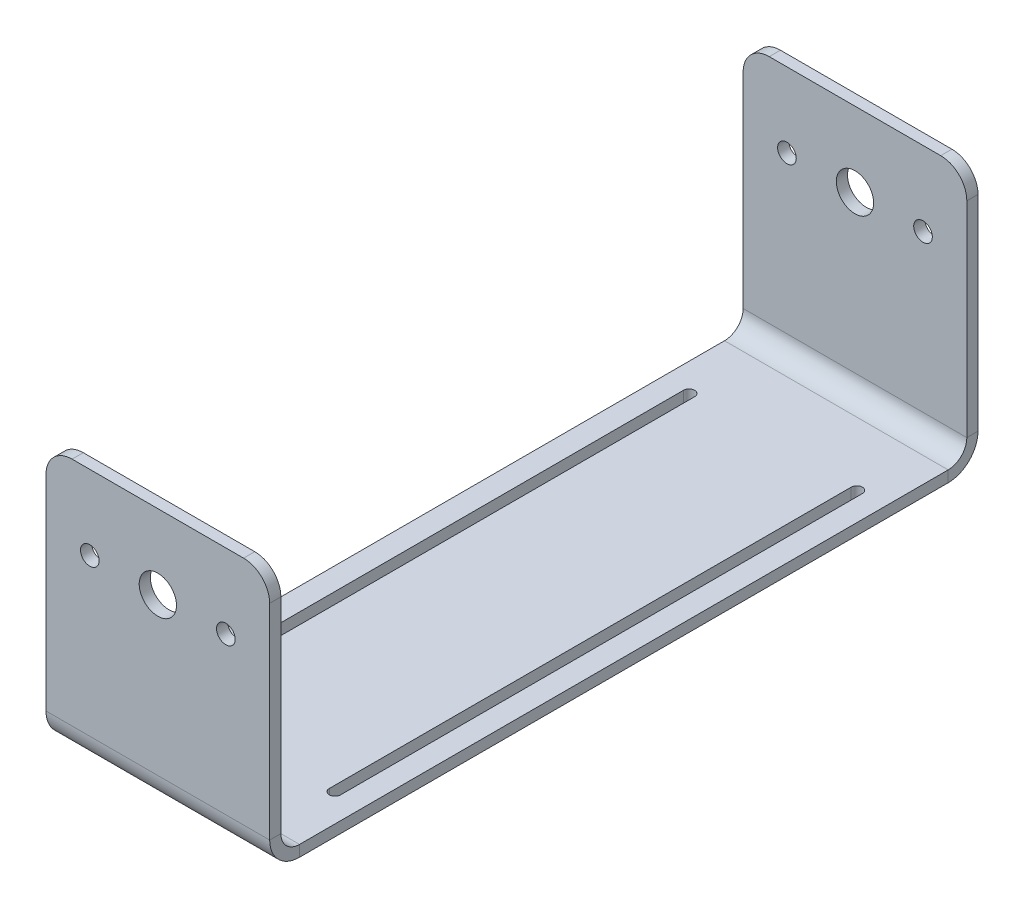
ISO-10303-21;
HEADER;
FILE_DESCRIPTION(('STEP AP214'),'2;1');
FILE_NAME('part.step','',(''),(''),'','','');
FILE_SCHEMA(('AUTOMOTIVE_DESIGN { 1 0 10303 214 1 1 1 1 }'));
ENDSEC;
DATA;
#1=APPLICATION_CONTEXT('core data for automotive mechanical design processes');
#2=APPLICATION_PROTOCOL_DEFINITION('international standard','automotive_design',2000,#1);
#3=PRODUCT_CONTEXT('',#1,'mechanical');
#4=PRODUCT('Part','Part','',(#3));
#5=PRODUCT_RELATED_PRODUCT_CATEGORY('part','',(#4));
#6=PRODUCT_DEFINITION_FORMATION('','',#4);
#7=PRODUCT_DEFINITION_CONTEXT('part definition',#1,'design');
#8=PRODUCT_DEFINITION('design','',#6,#7);
#9=PRODUCT_DEFINITION_SHAPE('','',#8);
#10=(LENGTH_UNIT() NAMED_UNIT(*) SI_UNIT(.MILLI.,.METRE.));
#11=(NAMED_UNIT(*) PLANE_ANGLE_UNIT() SI_UNIT($,.RADIAN.));
#12=(NAMED_UNIT(*) SI_UNIT($,.STERADIAN.) SOLID_ANGLE_UNIT());
#13=UNCERTAINTY_MEASURE_WITH_UNIT(LENGTH_MEASURE(1.E-05),#10,'distance_accuracy_value','');
#14=(GEOMETRIC_REPRESENTATION_CONTEXT(3) GLOBAL_UNCERTAINTY_ASSIGNED_CONTEXT((#13)) GLOBAL_UNIT_ASSIGNED_CONTEXT((#10,
#11,#12)) REPRESENTATION_CONTEXT('',''));
#15=CARTESIAN_POINT('',(0.,0.,0.));
#16=DIRECTION('',(0.,0.,1.));
#17=DIRECTION('',(1.,0.,0.));
#18=AXIS2_PLACEMENT_3D('',#15,#16,#17);
#19=CARTESIAN_POINT('',(60.,0.,-87.));
#20=DIRECTION('',(1.,0.,0.));
#21=DIRECTION('',(0.,0.,-1.));
#22=AXIS2_PLACEMENT_3D('',#19,#20,#21);
#23=PLANE('',#22);
#24=DIRECTION('',(0.,1.,0.));
#25=VECTOR('',#24,1.);
#26=CARTESIAN_POINT('',(60.,0.,-87.));
#27=LINE('',#26,#25);
#28=CARTESIAN_POINT('',(60.,0.,-87.));
#29=VERTEX_POINT('',#28);
#30=CARTESIAN_POINT('',(60.,3.00000000000003,-87.));
#31=VERTEX_POINT('',#30);
#32=EDGE_CURVE('E413',#29,#31,#27,.T.);
#33=ORIENTED_EDGE('',*,*,#32,.F.);
#34=CARTESIAN_POINT('',(60.,8.00000000000003,-87.));
#35=DIRECTION('',(1.,0.,0.));
#36=DIRECTION('',(0.,0.,-1.));
#37=AXIS2_PLACEMENT_3D('',#34,#35,#36);
#38=CIRCLE('',#37,8.);
#39=CARTESIAN_POINT('',(60.,8.00000000000004,-95.));
#40=VERTEX_POINT('',#39);
#41=EDGE_CURVE('E320',#40,#29,#38,.F.);
#42=ORIENTED_EDGE('',*,*,#41,.F.);
#43=DIRECTION('',(0.,0.,-1.));
#44=VECTOR('',#43,1.);
#45=CARTESIAN_POINT('',(60.,8.00000000000004,-92.));
#46=LINE('',#45,#44);
#47=CARTESIAN_POINT('',(60.,8.00000000000004,-92.));
#48=VERTEX_POINT('',#47);
#49=EDGE_CURVE('E410',#48,#40,#46,.T.);
#50=ORIENTED_EDGE('',*,*,#49,.F.);
#51=CARTESIAN_POINT('',(60.,8.00000000000003,-87.));
#52=DIRECTION('',(1.,0.,0.));
#53=DIRECTION('',(0.,0.,-1.));
#54=AXIS2_PLACEMENT_3D('',#51,#52,#53);
#55=CIRCLE('',#54,5.);
#56=EDGE_CURVE('E327',#48,#31,#55,.F.);
#57=ORIENTED_EDGE('',*,*,#56,.T.);
#58=EDGE_LOOP('',(#33,#42,#50,#57));
#59=FACE_BOUND('',#58,.T.);
#60=ADVANCED_FACE('F38',(#59),#23,.T.);
#61=CARTESIAN_POINT('',(60.,8.00000000000004,-92.));
#62=DIRECTION('',(1.,0.,0.));
#63=DIRECTION('',(0.,0.,-1.));
#64=AXIS2_PLACEMENT_3D('',#61,#62,#63);
#65=PLANE('',#64);
#66=DIRECTION('',(0.,0.,1.));
#67=VECTOR('',#66,1.);
#68=CARTESIAN_POINT('',(60.,0.,95.));
#69=LINE('',#68,#67);
#70=CARTESIAN_POINT('',(60.,0.,87.));
#71=VERTEX_POINT('',#70);
#72=EDGE_CURVE('E317',#29,#71,#69,.T.);
#73=ORIENTED_EDGE('',*,*,#72,.F.);
#74=ORIENTED_EDGE('',*,*,#32,.T.);
#75=DIRECTION('',(0.,0.,1.));
#76=VECTOR('',#75,1.);
#77=CARTESIAN_POINT('',(60.,3.,95.));
#78=LINE('',#77,#76);
#79=CARTESIAN_POINT('',(60.,3.,87.));
#80=VERTEX_POINT('',#79);
#81=EDGE_CURVE('E330',#31,#80,#78,.T.);
#82=ORIENTED_EDGE('',*,*,#81,.T.);
#83=DIRECTION('',(0.,-1.,0.));
#84=VECTOR('',#83,1.);
#85=CARTESIAN_POINT('',(60.,3.,87.));
#86=LINE('',#85,#84);
#87=EDGE_CURVE('E401',#80,#71,#86,.T.);
#88=ORIENTED_EDGE('',*,*,#87,.T.);
#89=EDGE_LOOP('',(#73,#74,#82,#88));
#90=FACE_BOUND('',#89,.T.);
#91=ADVANCED_FACE('F479',(#90),#65,.T.);
#92=CARTESIAN_POINT('',(0.,8.00000000000004,-95.));
#93=DIRECTION('',(-1.,0.,0.));
#94=DIRECTION('',(0.,0.,1.));
#95=AXIS2_PLACEMENT_3D('',#92,#93,#94);
#96=PLANE('',#95);
#97=DIRECTION('',(0.,0.,1.));
#98=VECTOR('',#97,1.);
#99=CARTESIAN_POINT('',(0.,8.00000000000004,-95.));
#100=LINE('',#99,#98);
#101=CARTESIAN_POINT('',(0.,8.00000000000004,-95.));
#102=VERTEX_POINT('',#101);
#103=CARTESIAN_POINT('',(0.,8.00000000000004,-92.));
#104=VERTEX_POINT('',#103);
#105=EDGE_CURVE('E407',#102,#104,#100,.T.);
#106=ORIENTED_EDGE('',*,*,#105,.F.);
#107=CARTESIAN_POINT('',(0.,8.00000000000003,-87.));
#108=DIRECTION('',(1.,0.,0.));
#109=DIRECTION('',(0.,0.,-1.));
#110=AXIS2_PLACEMENT_3D('',#107,#108,#109);
#111=CIRCLE('',#110,8.);
#112=CARTESIAN_POINT('',(0.,0.,-87.));
#113=VERTEX_POINT('',#112);
#114=EDGE_CURVE('E348',#102,#113,#111,.F.);
#115=ORIENTED_EDGE('',*,*,#114,.T.);
#116=DIRECTION('',(0.,-1.,0.));
#117=VECTOR('',#116,1.);
#118=CARTESIAN_POINT('',(0.,3.00000000000003,-87.));
#119=LINE('',#118,#117);
#120=CARTESIAN_POINT('',(0.,3.00000000000003,-87.));
#121=VERTEX_POINT('',#120);
#122=EDGE_CURVE('E405',#121,#113,#119,.T.);
#123=ORIENTED_EDGE('',*,*,#122,.F.);
#124=CARTESIAN_POINT('',(0.,8.00000000000003,-87.));
#125=DIRECTION('',(1.,0.,0.));
#126=DIRECTION('',(0.,0.,-1.));
#127=AXIS2_PLACEMENT_3D('',#124,#125,#126);
#128=CIRCLE('',#127,5.);
#129=EDGE_CURVE('E355',#104,#121,#128,.F.);
#130=ORIENTED_EDGE('',*,*,#129,.F.);
#131=EDGE_LOOP('',(#106,#115,#123,#130));
#132=FACE_BOUND('',#131,.T.);
#133=ADVANCED_FACE('F540',(#132),#96,.T.);
#134=CARTESIAN_POINT('',(0.,3.00000000000003,-87.));
#135=DIRECTION('',(-1.,0.,0.));
#136=DIRECTION('',(0.,0.,1.));
#137=AXIS2_PLACEMENT_3D('',#134,#135,#136);
#138=PLANE('',#137);
#139=DIRECTION('',(0.,-1.,0.));
#140=VECTOR('',#139,1.);
#141=CARTESIAN_POINT('',(0.,0.,-92.));
#142=LINE('',#141,#140);
#143=CARTESIAN_POINT('',(0.,63.,-92.));
#144=VERTEX_POINT('',#143);
#145=EDGE_CURVE('E353',#144,#104,#142,.T.);
#146=ORIENTED_EDGE('',*,*,#145,.F.);
#147=DIRECTION('',(0.,0.,-1.));
#148=VECTOR('',#147,1.);
#149=CARTESIAN_POINT('',(0.,63.,-86.9999999999997));
#150=LINE('',#149,#148);
#151=CARTESIAN_POINT('',(0.,63.0000000000001,-95.));
#152=VERTEX_POINT('',#151);
#153=EDGE_CURVE('E11',#144,#152,#150,.T.);
#154=ORIENTED_EDGE('',*,*,#153,.T.);
#155=DIRECTION('',(0.,-1.,0.));
#156=VECTOR('',#155,1.);
#157=CARTESIAN_POINT('',(0.,0.,-95.));
#158=LINE('',#157,#156);
#159=EDGE_CURVE('E351',#152,#102,#158,.T.);
#160=ORIENTED_EDGE('',*,*,#159,.T.);
#161=ORIENTED_EDGE('',*,*,#105,.T.);
#162=EDGE_LOOP('',(#146,#154,#160,#161));
#163=FACE_BOUND('',#162,.T.);
#164=ADVANCED_FACE('F556',(#163),#138,.T.);
#165=CARTESIAN_POINT('',(60.,8.,95.));
#166=DIRECTION('',(1.,0.,0.));
#167=DIRECTION('',(0.,0.,-1.));
#168=AXIS2_PLACEMENT_3D('',#165,#166,#167);
#169=PLANE('',#168);
#170=DIRECTION('',(0.,0.,-1.));
#171=VECTOR('',#170,1.);
#172=CARTESIAN_POINT('',(60.,8.,95.));
#173=LINE('',#172,#171);
#174=CARTESIAN_POINT('',(60.,8.,95.));
#175=VERTEX_POINT('',#174);
#176=CARTESIAN_POINT('',(60.,8.,92.));
#177=VERTEX_POINT('',#176);
#178=EDGE_CURVE('E403',#175,#177,#173,.T.);
#179=ORIENTED_EDGE('',*,*,#178,.F.);
#180=CARTESIAN_POINT('',(60.,8.,87.));
#181=DIRECTION('',(1.,0.,0.));
#182=DIRECTION('',(0.,0.,-1.));
#183=AXIS2_PLACEMENT_3D('',#180,#181,#182);
#184=CIRCLE('',#183,8.);
#185=EDGE_CURVE('E314',#71,#175,#184,.F.);
#186=ORIENTED_EDGE('',*,*,#185,.F.);
#187=ORIENTED_EDGE('',*,*,#87,.F.);
#188=CARTESIAN_POINT('',(60.,8.,87.));
#189=DIRECTION('',(1.,0.,0.));
#190=DIRECTION('',(0.,0.,-1.));
#191=AXIS2_PLACEMENT_3D('',#188,#189,#190);
#192=CIRCLE('',#191,5.);
#193=EDGE_CURVE('E333',#80,#177,#192,.F.);
#194=ORIENTED_EDGE('',*,*,#193,.T.);
#195=EDGE_LOOP('',(#179,#186,#187,#194));
#196=FACE_BOUND('',#195,.T.);
#197=ADVANCED_FACE('F488',(#196),#169,.T.);
#198=CARTESIAN_POINT('',(60.,3.,87.));
#199=DIRECTION('',(1.,0.,0.));
#200=DIRECTION('',(0.,0.,-1.));
#201=AXIS2_PLACEMENT_3D('',#198,#199,#200);
#202=PLANE('',#201);
#203=DIRECTION('',(0.,1.,0.));
#204=VECTOR('',#203,1.);
#205=CARTESIAN_POINT('',(60.,0.,92.));
#206=LINE('',#205,#204);
#207=CARTESIAN_POINT('',(60.,63.,92.));
#208=VERTEX_POINT('',#207);
#209=EDGE_CURVE('E307',#177,#208,#206,.T.);
#210=ORIENTED_EDGE('',*,*,#209,.T.);
#211=DIRECTION('',(0.,0.,-1.));
#212=VECTOR('',#211,1.);
#213=CARTESIAN_POINT('',(60.,63.,87.));
#214=LINE('',#213,#212);
#215=CARTESIAN_POINT('',(60.,63.,95.));
#216=VERTEX_POINT('',#215);
#217=EDGE_CURVE('E430',#208,#216,#214,.F.);
#218=ORIENTED_EDGE('',*,*,#217,.T.);
#219=DIRECTION('',(0.,1.,0.));
#220=VECTOR('',#219,1.);
#221=CARTESIAN_POINT('',(60.,0.,95.));
#222=LINE('',#221,#220);
#223=EDGE_CURVE('E310',#175,#216,#222,.T.);
#224=ORIENTED_EDGE('',*,*,#223,.F.);
#225=ORIENTED_EDGE('',*,*,#178,.T.);
#226=EDGE_LOOP('',(#210,#218,#224,#225));
#227=FACE_BOUND('',#226,.T.);
#228=ADVANCED_FACE('F498',(#227),#202,.T.);
#229=CARTESIAN_POINT('',(0.,0.,87.));
#230=DIRECTION('',(-1.,0.,0.));
#231=DIRECTION('',(0.,0.,1.));
#232=AXIS2_PLACEMENT_3D('',#229,#230,#231);
#233=PLANE('',#232);
#234=DIRECTION('',(0.,1.,0.));
#235=VECTOR('',#234,1.);
#236=CARTESIAN_POINT('',(0.,0.,87.));
#237=LINE('',#236,#235);
#238=CARTESIAN_POINT('',(0.,0.,87.));
#239=VERTEX_POINT('',#238);
#240=CARTESIAN_POINT('',(0.,3.,87.));
#241=VERTEX_POINT('',#240);
#242=EDGE_CURVE('E399',#239,#241,#237,.T.);
#243=ORIENTED_EDGE('',*,*,#242,.F.);
#244=CARTESIAN_POINT('',(0.,8.,87.));
#245=DIRECTION('',(1.,0.,0.));
#246=DIRECTION('',(0.,0.,-1.));
#247=AXIS2_PLACEMENT_3D('',#244,#245,#246);
#248=CIRCLE('',#247,8.);
#249=CARTESIAN_POINT('',(0.,8.,95.));
#250=VERTEX_POINT('',#249);
#251=EDGE_CURVE('E342',#239,#250,#248,.F.);
#252=ORIENTED_EDGE('',*,*,#251,.T.);
#253=DIRECTION('',(0.,0.,1.));
#254=VECTOR('',#253,1.);
#255=CARTESIAN_POINT('',(0.,8.,92.));
#256=LINE('',#255,#254);
#257=CARTESIAN_POINT('',(0.,8.,92.));
#258=VERTEX_POINT('',#257);
#259=EDGE_CURVE('E397',#258,#250,#256,.T.);
#260=ORIENTED_EDGE('',*,*,#259,.F.);
#261=CARTESIAN_POINT('',(0.,8.,87.));
#262=DIRECTION('',(1.,0.,0.));
#263=DIRECTION('',(0.,0.,-1.));
#264=AXIS2_PLACEMENT_3D('',#261,#262,#263);
#265=CIRCLE('',#264,5.);
#266=EDGE_CURVE('E311',#241,#258,#265,.F.);
#267=ORIENTED_EDGE('',*,*,#266,.F.);
#268=EDGE_LOOP('',(#243,#252,#260,#267));
#269=FACE_BOUND('',#268,.T.);
#270=ADVANCED_FACE('F518',(#269),#233,.T.);
#271=CARTESIAN_POINT('',(0.,8.,92.));
#272=DIRECTION('',(-1.,0.,0.));
#273=DIRECTION('',(0.,0.,1.));
#274=AXIS2_PLACEMENT_3D('',#271,#272,#273);
#275=PLANE('',#274);
#276=DIRECTION('',(0.,0.,1.));
#277=VECTOR('',#276,1.);
#278=CARTESIAN_POINT('',(0.,0.,95.));
#279=LINE('',#278,#277);
#280=EDGE_CURVE('E345',#113,#239,#279,.T.);
#281=ORIENTED_EDGE('',*,*,#280,.T.);
#282=ORIENTED_EDGE('',*,*,#242,.T.);
#283=DIRECTION('',(0.,0.,1.));
#284=VECTOR('',#283,1.);
#285=CARTESIAN_POINT('',(0.,3.,95.));
#286=LINE('',#285,#284);
#287=EDGE_CURVE('E358',#121,#241,#286,.T.);
#288=ORIENTED_EDGE('',*,*,#287,.F.);
#289=ORIENTED_EDGE('',*,*,#122,.T.);
#290=EDGE_LOOP('',(#281,#282,#288,#289));
#291=FACE_BOUND('',#290,.T.);
#292=ADVANCED_FACE('F524',(#291),#275,.T.);
#293=CARTESIAN_POINT('',(60.,0.,92.));
#294=DIRECTION('',(0.,0.,1.));
#295=DIRECTION('',(1.,0.,0.));
#296=AXIS2_PLACEMENT_3D('',#293,#294,#295);
#297=PLANE('',#296);
#298=CARTESIAN_POINT('',(48.25,50.,92.));
#299=DIRECTION('',(0.,0.,1.));
#300=DIRECTION('',(1.,0.,0.));
#301=AXIS2_PLACEMENT_3D('',#298,#299,#300);
#302=CIRCLE('',#301,2.5);
#303=CARTESIAN_POINT('',(50.75,50.,92.));
#304=VERTEX_POINT('',#303);
#305=EDGE_CURVE('E303',#304,#304,#302,.T.);
#306=ORIENTED_EDGE('',*,*,#305,.T.);
#307=EDGE_LOOP('',(#306));
#308=FACE_BOUND('',#307,.T.);
#309=CARTESIAN_POINT('',(11.75,50.,92.));
#310=DIRECTION('',(0.,0.,1.));
#311=DIRECTION('',(1.,0.,0.));
#312=AXIS2_PLACEMENT_3D('',#309,#310,#311);
#313=CIRCLE('',#312,2.5);
#314=CARTESIAN_POINT('',(14.25,50.,92.));
#315=VERTEX_POINT('',#314);
#316=EDGE_CURVE('E299',#315,#315,#313,.T.);
#317=ORIENTED_EDGE('',*,*,#316,.T.);
#318=EDGE_LOOP('',(#317));
#319=FACE_BOUND('',#318,.T.);
#320=CARTESIAN_POINT('',(30.,50.,92.));
#321=DIRECTION('',(0.,0.,1.));
#322=DIRECTION('',(1.,0.,0.));
#323=AXIS2_PLACEMENT_3D('',#320,#321,#322);
#324=CIRCLE('',#323,5.);
#325=CARTESIAN_POINT('',(35.,50.,92.));
#326=VERTEX_POINT('',#325);
#327=EDGE_CURVE('E295',#326,#326,#324,.T.);
#328=ORIENTED_EDGE('',*,*,#327,.T.);
#329=EDGE_LOOP('',(#328));
#330=FACE_BOUND('',#329,.T.);
#331=DIRECTION('',(-1.,0.,0.));
#332=VECTOR('',#331,1.);
#333=CARTESIAN_POINT('',(60.,70.,92.));
#334=LINE('',#333,#332);
#335=CARTESIAN_POINT('',(53.,70.,92.));
#336=VERTEX_POINT('',#335);
#337=CARTESIAN_POINT('',(7.,70.,92.));
#338=VERTEX_POINT('',#337);
#339=EDGE_CURVE('E394',#336,#338,#334,.T.);
#340=ORIENTED_EDGE('',*,*,#339,.F.);
#341=CARTESIAN_POINT('',(53.,63.,92.));
#342=DIRECTION('',(0.,0.,1.));
#343=DIRECTION('',(1.,0.,0.));
#344=AXIS2_PLACEMENT_3D('',#341,#342,#343);
#345=CIRCLE('',#344,7.);
#346=EDGE_CURVE('E428',#336,#208,#345,.F.);
#347=ORIENTED_EDGE('',*,*,#346,.T.);
#348=ORIENTED_EDGE('',*,*,#209,.F.);
#349=DIRECTION('',(-1.,0.,0.));
#350=VECTOR('',#349,1.);
#351=CARTESIAN_POINT('',(60.,8.,92.));
#352=LINE('',#351,#350);
#353=EDGE_CURVE('E336',#177,#258,#352,.T.);
#354=ORIENTED_EDGE('',*,*,#353,.T.);
#355=DIRECTION('',(0.,1.,0.));
#356=VECTOR('',#355,1.);
#357=CARTESIAN_POINT('',(0.,0.,92.));
#358=LINE('',#357,#356);
#359=CARTESIAN_POINT('',(0.,63.,92.));
#360=VERTEX_POINT('',#359);
#361=EDGE_CURVE('E306',#258,#360,#358,.T.);
#362=ORIENTED_EDGE('',*,*,#361,.T.);
#363=CARTESIAN_POINT('',(7.,63.,92.));
#364=DIRECTION('',(0.,0.,1.));
#365=DIRECTION('',(1.,0.,0.));
#366=AXIS2_PLACEMENT_3D('',#363,#364,#365);
#367=CIRCLE('',#366,7.);
#368=EDGE_CURVE('E426',#360,#338,#367,.F.);
#369=ORIENTED_EDGE('',*,*,#368,.T.);
#370=EDGE_LOOP('',(#340,#347,#348,#354,#362,#369));
#371=FACE_BOUND('',#370,.T.);
#372=ADVANCED_FACE('F522',(#308,#319,#330,#371),#297,.F.);
#373=CARTESIAN_POINT('',(60.,70.,95.));
#374=DIRECTION('',(0.,1.,0.));
#375=DIRECTION('',(0.,0.,1.));
#376=AXIS2_PLACEMENT_3D('',#373,#374,#375);
#377=PLANE('',#376);
#378=DIRECTION('',(-1.,0.,0.));
#379=VECTOR('',#378,1.);
#380=CARTESIAN_POINT('',(60.,70.,95.));
#381=LINE('',#380,#379);
#382=CARTESIAN_POINT('',(53.,70.,95.));
#383=VERTEX_POINT('',#382);
#384=CARTESIAN_POINT('',(7.,70.,95.));
#385=VERTEX_POINT('',#384);
#386=EDGE_CURVE('E391',#383,#385,#381,.T.);
#387=ORIENTED_EDGE('',*,*,#386,.F.);
#388=DIRECTION('',(0.,0.,-1.));
#389=VECTOR('',#388,1.);
#390=CARTESIAN_POINT('',(53.,70.,95.));
#391=LINE('',#390,#389);
#392=EDGE_CURVE('E423',#383,#336,#391,.T.);
#393=ORIENTED_EDGE('',*,*,#392,.T.);
#394=ORIENTED_EDGE('',*,*,#339,.T.);
#395=DIRECTION('',(0.,0.,-1.));
#396=VECTOR('',#395,1.);
#397=CARTESIAN_POINT('',(7.,70.,95.));
#398=LINE('',#397,#396);
#399=EDGE_CURVE('E415',#338,#385,#398,.F.);
#400=ORIENTED_EDGE('',*,*,#399,.T.);
#401=EDGE_LOOP('',(#387,#393,#394,#400));
#402=FACE_BOUND('',#401,.T.);
#403=ADVANCED_FACE('F507',(#402),#377,.T.);
#404=CARTESIAN_POINT('',(60.,0.,95.));
#405=DIRECTION('',(0.,0.,1.));
#406=DIRECTION('',(1.,0.,0.));
#407=AXIS2_PLACEMENT_3D('',#404,#405,#406);
#408=PLANE('',#407);
#409=CARTESIAN_POINT('',(48.25,50.,95.));
#410=DIRECTION('',(0.,0.,1.));
#411=DIRECTION('',(1.,0.,0.));
#412=AXIS2_PLACEMENT_3D('',#409,#410,#411);
#413=CIRCLE('',#412,2.5);
#414=CARTESIAN_POINT('',(50.75,50.,95.));
#415=VERTEX_POINT('',#414);
#416=EDGE_CURVE('E242',#415,#415,#413,.T.);
#417=ORIENTED_EDGE('',*,*,#416,.F.);
#418=EDGE_LOOP('',(#417));
#419=FACE_BOUND('',#418,.T.);
#420=CARTESIAN_POINT('',(11.75,50.,95.));
#421=DIRECTION('',(0.,0.,1.));
#422=DIRECTION('',(1.,0.,0.));
#423=AXIS2_PLACEMENT_3D('',#420,#421,#422);
#424=CIRCLE('',#423,2.5);
#425=CARTESIAN_POINT('',(14.25,50.,95.));
#426=VERTEX_POINT('',#425);
#427=EDGE_CURVE('E281',#426,#426,#424,.T.);
#428=ORIENTED_EDGE('',*,*,#427,.F.);
#429=EDGE_LOOP('',(#428));
#430=FACE_BOUND('',#429,.T.);
#431=CARTESIAN_POINT('',(30.,50.,95.));
#432=DIRECTION('',(0.,0.,1.));
#433=DIRECTION('',(1.,0.,0.));
#434=AXIS2_PLACEMENT_3D('',#431,#432,#433);
#435=CIRCLE('',#434,5.);
#436=CARTESIAN_POINT('',(35.,50.,95.));
#437=VERTEX_POINT('',#436);
#438=EDGE_CURVE('E280',#437,#437,#435,.T.);
#439=ORIENTED_EDGE('',*,*,#438,.F.);
#440=EDGE_LOOP('',(#439));
#441=FACE_BOUND('',#440,.T.);
#442=ORIENTED_EDGE('',*,*,#223,.T.);
#443=CARTESIAN_POINT('',(53.,63.,95.));
#444=DIRECTION('',(0.,0.,1.));
#445=DIRECTION('',(1.,0.,0.));
#446=AXIS2_PLACEMENT_3D('',#443,#444,#445);
#447=CIRCLE('',#446,7.);
#448=EDGE_CURVE('E434',#216,#383,#447,.T.);
#449=ORIENTED_EDGE('',*,*,#448,.T.);
#450=ORIENTED_EDGE('',*,*,#386,.T.);
#451=CARTESIAN_POINT('',(7.,63.,95.));
#452=DIRECTION('',(0.,0.,1.));
#453=DIRECTION('',(1.,0.,0.));
#454=AXIS2_PLACEMENT_3D('',#451,#452,#453);
#455=CIRCLE('',#454,7.);
#456=CARTESIAN_POINT('',(0.,63.,95.));
#457=VERTEX_POINT('',#456);
#458=EDGE_CURVE('E432',#385,#457,#455,.T.);
#459=ORIENTED_EDGE('',*,*,#458,.T.);
#460=DIRECTION('',(0.,1.,0.));
#461=VECTOR('',#460,1.);
#462=CARTESIAN_POINT('',(0.,0.,95.));
#463=LINE('',#462,#461);
#464=EDGE_CURVE('E339',#250,#457,#463,.T.);
#465=ORIENTED_EDGE('',*,*,#464,.F.);
#466=DIRECTION('',(-1.,0.,0.));
#467=VECTOR('',#466,1.);
#468=CARTESIAN_POINT('',(60.,8.,95.));
#469=LINE('',#468,#467);
#470=EDGE_CURVE('E388',#175,#250,#469,.T.);
#471=ORIENTED_EDGE('',*,*,#470,.F.);
#472=EDGE_LOOP('',(#442,#449,#450,#459,#465,#471));
#473=FACE_BOUND('',#472,.T.);
#474=ADVANCED_FACE('F496',(#419,#430,#441,#473),#408,.T.);
#475=CARTESIAN_POINT('',(60.,8.,87.));
#476=DIRECTION('',(-1.,0.,0.));
#477=DIRECTION('',(0.,0.,1.));
#478=AXIS2_PLACEMENT_3D('',#475,#476,#477);
#479=CYLINDRICAL_SURFACE('',#478,8.);
#480=ORIENTED_EDGE('',*,*,#251,.F.);
#481=DIRECTION('',(-1.,0.,0.));
#482=VECTOR('',#481,1.);
#483=CARTESIAN_POINT('',(60.,0.,87.));
#484=LINE('',#483,#482);
#485=EDGE_CURVE('E385',#71,#239,#484,.T.);
#486=ORIENTED_EDGE('',*,*,#485,.F.);
#487=ORIENTED_EDGE('',*,*,#185,.T.);
#488=ORIENTED_EDGE('',*,*,#470,.T.);
#489=EDGE_LOOP('',(#480,#486,#487,#488));
#490=FACE_BOUND('',#489,.T.);
#491=ADVANCED_FACE('F487',(#490),#479,.T.);
#492=CARTESIAN_POINT('',(60.,0.,95.));
#493=DIRECTION('',(0.,-1.,0.));
#494=DIRECTION('',(0.,0.,-1.));
#495=AXIS2_PLACEMENT_3D('',#492,#493,#494);
#496=PLANE('',#495);
#497=CARTESIAN_POINT('',(7.5,0.,-70.0000000000001));
#498=DIRECTION('',(0.,-1.,0.));
#499=DIRECTION('',(0.,0.,-1.));
#500=AXIS2_PLACEMENT_3D('',#497,#498,#499);
#501=CIRCLE('',#500,1.5);
#502=CARTESIAN_POINT('',(6.00000000000002,0.,-70.));
#503=VERTEX_POINT('',#502);
#504=CARTESIAN_POINT('',(9.00000000000002,0.,-70.));
#505=VERTEX_POINT('',#504);
#506=EDGE_CURVE('E208',#503,#505,#501,.T.);
#507=ORIENTED_EDGE('',*,*,#506,.F.);
#508=DIRECTION('',(0.,0.,-1.));
#509=VECTOR('',#508,1.);
#510=CARTESIAN_POINT('',(6.00000000000002,0.,-70.));
#511=LINE('',#510,#509);
#512=CARTESIAN_POINT('',(6.00000000000002,0.,70.));
#513=VERTEX_POINT('',#512);
#514=EDGE_CURVE('E226',#513,#503,#511,.T.);
#515=ORIENTED_EDGE('',*,*,#514,.F.);
#516=CARTESIAN_POINT('',(7.5,0.,70.0000000000001));
#517=DIRECTION('',(0.,-1.,0.));
#518=DIRECTION('',(0.,0.,-1.));
#519=AXIS2_PLACEMENT_3D('',#516,#517,#518);
#520=CIRCLE('',#519,1.5);
#521=CARTESIAN_POINT('',(9.,0.,70.));
#522=VERTEX_POINT('',#521);
#523=EDGE_CURVE('E229',#522,#513,#520,.T.);
#524=ORIENTED_EDGE('',*,*,#523,.F.);
#525=DIRECTION('',(0.,0.,1.));
#526=VECTOR('',#525,1.);
#527=CARTESIAN_POINT('',(9.00000000000002,0.,-70.));
#528=LINE('',#527,#526);
#529=EDGE_CURVE('E235',#505,#522,#528,.T.);
#530=ORIENTED_EDGE('',*,*,#529,.F.);
#531=EDGE_LOOP('',(#507,#515,#524,#530));
#532=FACE_BOUND('',#531,.T.);
#533=CARTESIAN_POINT('',(52.5,0.,-70.0000000000001));
#534=DIRECTION('',(0.,-1.,0.));
#535=DIRECTION('',(0.,0.,1.));
#536=AXIS2_PLACEMENT_3D('',#533,#534,#535);
#537=CIRCLE('',#536,1.5);
#538=CARTESIAN_POINT('',(51.,0.,-70.));
#539=VERTEX_POINT('',#538);
#540=CARTESIAN_POINT('',(54.,0.,-70.));
#541=VERTEX_POINT('',#540);
#542=EDGE_CURVE('E260',#539,#541,#537,.T.);
#543=ORIENTED_EDGE('',*,*,#542,.F.);
#544=DIRECTION('',(0.,0.,-1.));
#545=VECTOR('',#544,1.);
#546=CARTESIAN_POINT('',(51.,0.,-70.));
#547=LINE('',#546,#545);
#548=CARTESIAN_POINT('',(51.,0.,70.));
#549=VERTEX_POINT('',#548);
#550=EDGE_CURVE('E250',#549,#539,#547,.T.);
#551=ORIENTED_EDGE('',*,*,#550,.F.);
#552=CARTESIAN_POINT('',(52.5,0.,70.0000000000001));
#553=DIRECTION('',(0.,-1.,0.));
#554=DIRECTION('',(0.,0.,1.));
#555=AXIS2_PLACEMENT_3D('',#552,#553,#554);
#556=CIRCLE('',#555,1.5);
#557=CARTESIAN_POINT('',(54.,0.,70.));
#558=VERTEX_POINT('',#557);
#559=EDGE_CURVE('E265',#558,#549,#556,.T.);
#560=ORIENTED_EDGE('',*,*,#559,.F.);
#561=DIRECTION('',(0.,0.,1.));
#562=VECTOR('',#561,1.);
#563=CARTESIAN_POINT('',(54.,0.,-70.));
#564=LINE('',#563,#562);
#565=EDGE_CURVE('E262',#541,#558,#564,.T.);
#566=ORIENTED_EDGE('',*,*,#565,.F.);
#567=EDGE_LOOP('',(#543,#551,#560,#566));
#568=FACE_BOUND('',#567,.T.);
#569=ORIENTED_EDGE('',*,*,#280,.F.);
#570=DIRECTION('',(-1.,0.,0.));
#571=VECTOR('',#570,1.);
#572=CARTESIAN_POINT('',(60.,0.,-87.));
#573=LINE('',#572,#571);
#574=EDGE_CURVE('E382',#29,#113,#573,.T.);
#575=ORIENTED_EDGE('',*,*,#574,.F.);
#576=ORIENTED_EDGE('',*,*,#72,.T.);
#577=ORIENTED_EDGE('',*,*,#485,.T.);
#578=EDGE_LOOP('',(#569,#575,#576,#577));
#579=FACE_BOUND('',#578,.T.);
#580=ADVANCED_FACE('F478',(#532,#568,#579),#496,.T.);
#581=CARTESIAN_POINT('',(60.,8.00000000000003,-87.));
#582=DIRECTION('',(-1.,0.,0.));
#583=DIRECTION('',(0.,0.,1.));
#584=AXIS2_PLACEMENT_3D('',#581,#582,#583);
#585=CYLINDRICAL_SURFACE('',#584,8.);
#586=ORIENTED_EDGE('',*,*,#114,.F.);
#587=DIRECTION('',(-1.,0.,0.));
#588=VECTOR('',#587,1.);
#589=CARTESIAN_POINT('',(60.,8.00000000000004,-95.));
#590=LINE('',#589,#588);
#591=EDGE_CURVE('E379',#40,#102,#590,.T.);
#592=ORIENTED_EDGE('',*,*,#591,.F.);
#593=ORIENTED_EDGE('',*,*,#41,.T.);
#594=ORIENTED_EDGE('',*,*,#574,.T.);
#595=EDGE_LOOP('',(#586,#592,#593,#594));
#596=FACE_BOUND('',#595,.T.);
#597=ADVANCED_FACE('F469',(#596),#585,.T.);
#598=CARTESIAN_POINT('',(60.,0.,-95.));
#599=DIRECTION('',(0.,0.,-1.));
#600=DIRECTION('',(0.,1.,0.));
#601=AXIS2_PLACEMENT_3D('',#598,#599,#600);
#602=PLANE('',#601);
#603=CARTESIAN_POINT('',(48.25,50.,-95.));
#604=DIRECTION('',(0.,0.,1.));
#605=DIRECTION('',(1.,0.,0.));
#606=AXIS2_PLACEMENT_3D('',#603,#604,#605);
#607=CIRCLE('',#606,2.5);
#608=CARTESIAN_POINT('',(50.75,50.,-95.));
#609=VERTEX_POINT('',#608);
#610=EDGE_CURVE('E284',#609,#609,#607,.T.);
#611=ORIENTED_EDGE('',*,*,#610,.T.);
#612=EDGE_LOOP('',(#611));
#613=FACE_BOUND('',#612,.T.);
#614=CARTESIAN_POINT('',(11.75,50.,-95.));
#615=DIRECTION('',(0.,0.,1.));
#616=DIRECTION('',(1.,0.,0.));
#617=AXIS2_PLACEMENT_3D('',#614,#615,#616);
#618=CIRCLE('',#617,2.5);
#619=CARTESIAN_POINT('',(14.25,50.,-95.));
#620=VERTEX_POINT('',#619);
#621=EDGE_CURVE('E277',#620,#620,#618,.T.);
#622=ORIENTED_EDGE('',*,*,#621,.T.);
#623=EDGE_LOOP('',(#622));
#624=FACE_BOUND('',#623,.T.);
#625=CARTESIAN_POINT('',(30.,50.,-95.));
#626=DIRECTION('',(0.,0.,1.));
#627=DIRECTION('',(1.,0.,0.));
#628=AXIS2_PLACEMENT_3D('',#625,#626,#627);
#629=CIRCLE('',#628,5.);
#630=CARTESIAN_POINT('',(35.,50.,-95.));
#631=VERTEX_POINT('',#630);
#632=EDGE_CURVE('E289',#631,#631,#629,.T.);
#633=ORIENTED_EDGE('',*,*,#632,.T.);
#634=EDGE_LOOP('',(#633));
#635=FACE_BOUND('',#634,.T.);
#636=DIRECTION('',(-1.,0.,0.));
#637=VECTOR('',#636,1.);
#638=CARTESIAN_POINT('',(60.,70.,-95.));
#639=LINE('',#638,#637);
#640=CARTESIAN_POINT('',(53.,70.,-95.));
#641=VERTEX_POINT('',#640);
#642=CARTESIAN_POINT('',(7.,70.,-95.));
#643=VERTEX_POINT('',#642);
#644=EDGE_CURVE('E376',#641,#643,#639,.T.);
#645=ORIENTED_EDGE('',*,*,#644,.F.);
#646=CARTESIAN_POINT('',(53.,63.,-95.));
#647=DIRECTION('',(0.,0.,-1.));
#648=DIRECTION('',(0.,1.,0.));
#649=AXIS2_PLACEMENT_3D('',#646,#647,#648);
#650=CIRCLE('',#649,7.);
#651=CARTESIAN_POINT('',(60.,63.,-95.));
#652=VERTEX_POINT('',#651);
#653=EDGE_CURVE('E446',#641,#652,#650,.T.);
#654=ORIENTED_EDGE('',*,*,#653,.T.);
#655=DIRECTION('',(0.,-1.,0.));
#656=VECTOR('',#655,1.);
#657=CARTESIAN_POINT('',(60.,0.,-95.));
#658=LINE('',#657,#656);
#659=EDGE_CURVE('E323',#652,#40,#658,.T.);
#660=ORIENTED_EDGE('',*,*,#659,.T.);
#661=ORIENTED_EDGE('',*,*,#591,.T.);
#662=ORIENTED_EDGE('',*,*,#159,.F.);
#663=CARTESIAN_POINT('',(7.,63.0000000000001,-95.));
#664=DIRECTION('',(0.,0.,-1.));
#665=DIRECTION('',(0.,1.,0.));
#666=AXIS2_PLACEMENT_3D('',#663,#664,#665);
#667=CIRCLE('',#666,7.);
#668=EDGE_CURVE('E444',#152,#643,#667,.T.);
#669=ORIENTED_EDGE('',*,*,#668,.T.);
#670=EDGE_LOOP('',(#645,#654,#660,#661,#662,#669));
#671=FACE_BOUND('',#670,.T.);
#672=ADVANCED_FACE('F461',(#613,#624,#635,#671),#602,.T.);
#673=CARTESIAN_POINT('',(60.,70.,-92.));
#674=DIRECTION('',(0.,1.,0.));
#675=DIRECTION('',(0.,0.,1.));
#676=AXIS2_PLACEMENT_3D('',#673,#674,#675);
#677=PLANE('',#676);
#678=DIRECTION('',(-1.,0.,0.));
#679=VECTOR('',#678,1.);
#680=CARTESIAN_POINT('',(60.,70.,-92.));
#681=LINE('',#680,#679);
#682=CARTESIAN_POINT('',(53.,70.,-92.));
#683=VERTEX_POINT('',#682);
#684=CARTESIAN_POINT('',(7.,70.,-92.));
#685=VERTEX_POINT('',#684);
#686=EDGE_CURVE('E374',#683,#685,#681,.T.);
#687=ORIENTED_EDGE('',*,*,#686,.F.);
#688=DIRECTION('',(0.,0.,-1.));
#689=VECTOR('',#688,1.);
#690=CARTESIAN_POINT('',(53.,70.,-92.));
#691=LINE('',#690,#689);
#692=EDGE_CURVE('E441',#683,#641,#691,.T.);
#693=ORIENTED_EDGE('',*,*,#692,.T.);
#694=ORIENTED_EDGE('',*,*,#644,.T.);
#695=DIRECTION('',(0.,0.,-1.));
#696=VECTOR('',#695,1.);
#697=CARTESIAN_POINT('',(7.,70.,-92.));
#698=LINE('',#697,#696);
#699=EDGE_CURVE('E439',#643,#685,#698,.F.);
#700=ORIENTED_EDGE('',*,*,#699,.T.);
#701=EDGE_LOOP('',(#687,#693,#694,#700));
#702=FACE_BOUND('',#701,.T.);
#703=ADVANCED_FACE('F456',(#702),#677,.T.);
#704=CARTESIAN_POINT('',(60.,0.,-92.));
#705=DIRECTION('',(0.,0.,-1.));
#706=DIRECTION('',(0.,1.,0.));
#707=AXIS2_PLACEMENT_3D('',#704,#705,#706);
#708=PLANE('',#707);
#709=CARTESIAN_POINT('',(48.25,50.,-92.));
#710=DIRECTION('',(0.,0.,-1.));
#711=DIRECTION('',(0.,1.,0.));
#712=AXIS2_PLACEMENT_3D('',#709,#710,#711);
#713=CIRCLE('',#712,2.5);
#714=CARTESIAN_POINT('',(48.25,52.5,-92.));
#715=VERTEX_POINT('',#714);
#716=EDGE_CURVE('E302',#715,#715,#713,.T.);
#717=ORIENTED_EDGE('',*,*,#716,.T.);
#718=EDGE_LOOP('',(#717));
#719=FACE_BOUND('',#718,.T.);
#720=CARTESIAN_POINT('',(11.75,50.,-92.));
#721=DIRECTION('',(0.,0.,-1.));
#722=DIRECTION('',(0.,1.,0.));
#723=AXIS2_PLACEMENT_3D('',#720,#721,#722);
#724=CIRCLE('',#723,2.5);
#725=CARTESIAN_POINT('',(11.75,52.5,-92.));
#726=VERTEX_POINT('',#725);
#727=EDGE_CURVE('E298',#726,#726,#724,.T.);
#728=ORIENTED_EDGE('',*,*,#727,.T.);
#729=EDGE_LOOP('',(#728));
#730=FACE_BOUND('',#729,.T.);
#731=CARTESIAN_POINT('',(30.,50.,-92.));
#732=DIRECTION('',(0.,0.,-1.));
#733=DIRECTION('',(0.,1.,0.));
#734=AXIS2_PLACEMENT_3D('',#731,#732,#733);
#735=CIRCLE('',#734,5.);
#736=CARTESIAN_POINT('',(30.,55.,-92.));
#737=VERTEX_POINT('',#736);
#738=EDGE_CURVE('E292',#737,#737,#735,.T.);
#739=ORIENTED_EDGE('',*,*,#738,.T.);
#740=EDGE_LOOP('',(#739));
#741=FACE_BOUND('',#740,.T.);
#742=DIRECTION('',(0.,-1.,0.));
#743=VECTOR('',#742,1.);
#744=CARTESIAN_POINT('',(60.,0.,-92.));
#745=LINE('',#744,#743);
#746=CARTESIAN_POINT('',(60.,63.,-92.));
#747=VERTEX_POINT('',#746);
#748=EDGE_CURVE('E325',#747,#48,#745,.T.);
#749=ORIENTED_EDGE('',*,*,#748,.F.);
#750=CARTESIAN_POINT('',(53.,63.,-92.));
#751=DIRECTION('',(0.,0.,-1.));
#752=DIRECTION('',(0.,1.,0.));
#753=AXIS2_PLACEMENT_3D('',#750,#751,#752);
#754=CIRCLE('',#753,7.);
#755=EDGE_CURVE('E46',#747,#683,#754,.F.);
#756=ORIENTED_EDGE('',*,*,#755,.T.);
#757=ORIENTED_EDGE('',*,*,#686,.T.);
#758=CARTESIAN_POINT('',(7.,63.,-92.));
#759=DIRECTION('',(0.,0.,-1.));
#760=DIRECTION('',(0.,1.,0.));
#761=AXIS2_PLACEMENT_3D('',#758,#759,#760);
#762=CIRCLE('',#761,7.);
#763=EDGE_CURVE('E53',#685,#144,#762,.F.);
#764=ORIENTED_EDGE('',*,*,#763,.T.);
#765=ORIENTED_EDGE('',*,*,#145,.T.);
#766=DIRECTION('',(-1.,0.,0.));
#767=VECTOR('',#766,1.);
#768=CARTESIAN_POINT('',(60.,8.00000000000004,-92.));
#769=LINE('',#768,#767);
#770=EDGE_CURVE('E371',#48,#104,#769,.T.);
#771=ORIENTED_EDGE('',*,*,#770,.F.);
#772=EDGE_LOOP('',(#749,#756,#757,#764,#765,#771));
#773=FACE_BOUND('',#772,.T.);
#774=ADVANCED_FACE('F451',(#719,#730,#741,#773),#708,.F.);
#775=CARTESIAN_POINT('',(60.,8.00000000000003,-87.));
#776=DIRECTION('',(-1.,0.,0.));
#777=DIRECTION('',(0.,0.,1.));
#778=AXIS2_PLACEMENT_3D('',#775,#776,#777);
#779=CYLINDRICAL_SURFACE('',#778,5.);
#780=ORIENTED_EDGE('',*,*,#129,.T.);
#781=DIRECTION('',(-1.,0.,0.));
#782=VECTOR('',#781,1.);
#783=CARTESIAN_POINT('',(60.,3.00000000000003,-87.));
#784=LINE('',#783,#782);
#785=EDGE_CURVE('E368',#31,#121,#784,.T.);
#786=ORIENTED_EDGE('',*,*,#785,.F.);
#787=ORIENTED_EDGE('',*,*,#56,.F.);
#788=ORIENTED_EDGE('',*,*,#770,.T.);
#789=EDGE_LOOP('',(#780,#786,#787,#788));
#790=FACE_BOUND('',#789,.T.);
#791=ADVANCED_FACE('F560',(#790),#779,.F.);
#792=CARTESIAN_POINT('',(60.,3.,95.));
#793=DIRECTION('',(0.,-1.,0.));
#794=DIRECTION('',(0.,0.,-1.));
#795=AXIS2_PLACEMENT_3D('',#792,#793,#794);
#796=PLANE('',#795);
#797=DIRECTION('',(0.,0.,-1.));
#798=VECTOR('',#797,1.);
#799=CARTESIAN_POINT('',(6.00000000000002,3.00000000000001,-70.));
#800=LINE('',#799,#798);
#801=CARTESIAN_POINT('',(6.00000000000002,2.99999999999999,70.));
#802=VERTEX_POINT('',#801);
#803=CARTESIAN_POINT('',(6.00000000000002,3.00000000000001,-70.));
#804=VERTEX_POINT('',#803);
#805=EDGE_CURVE('E213',#802,#804,#800,.T.);
#806=ORIENTED_EDGE('',*,*,#805,.T.);
#807=CARTESIAN_POINT('',(7.5,3.00000000000001,-70.0000000000001));
#808=DIRECTION('',(0.,-1.,0.));
#809=DIRECTION('',(0.,0.,-1.));
#810=AXIS2_PLACEMENT_3D('',#807,#808,#809);
#811=CIRCLE('',#810,1.5);
#812=CARTESIAN_POINT('',(9.00000000000002,3.00000000000001,-70.));
#813=VERTEX_POINT('',#812);
#814=EDGE_CURVE('E205',#804,#813,#811,.T.);
#815=ORIENTED_EDGE('',*,*,#814,.T.);
#816=DIRECTION('',(0.,0.,1.));
#817=VECTOR('',#816,1.);
#818=CARTESIAN_POINT('',(9.00000000000002,3.00000000000001,-70.));
#819=LINE('',#818,#817);
#820=CARTESIAN_POINT('',(9.00000000000002,3.,70.));
#821=VERTEX_POINT('',#820);
#822=EDGE_CURVE('E217',#813,#821,#819,.T.);
#823=ORIENTED_EDGE('',*,*,#822,.T.);
#824=CARTESIAN_POINT('',(7.5,2.99999999999999,70.0000000000001));
#825=DIRECTION('',(0.,-1.,0.));
#826=DIRECTION('',(0.,0.,-1.));
#827=AXIS2_PLACEMENT_3D('',#824,#825,#826);
#828=CIRCLE('',#827,1.5);
#829=EDGE_CURVE('E221',#821,#802,#828,.T.);
#830=ORIENTED_EDGE('',*,*,#829,.T.);
#831=EDGE_LOOP('',(#806,#815,#823,#830));
#832=FACE_BOUND('',#831,.T.);
#833=DIRECTION('',(0.,0.,-1.));
#834=VECTOR('',#833,1.);
#835=CARTESIAN_POINT('',(51.,3.00000000000001,-70.));
#836=LINE('',#835,#834);
#837=CARTESIAN_POINT('',(51.,2.99999999999999,70.));
#838=VERTEX_POINT('',#837);
#839=CARTESIAN_POINT('',(51.,3.00000000000001,-70.));
#840=VERTEX_POINT('',#839);
#841=EDGE_CURVE('E256',#838,#840,#836,.T.);
#842=ORIENTED_EDGE('',*,*,#841,.T.);
#843=CARTESIAN_POINT('',(52.5,3.00000000000001,-70.0000000000001));
#844=DIRECTION('',(0.,-1.,0.));
#845=DIRECTION('',(0.,0.,1.));
#846=AXIS2_PLACEMENT_3D('',#843,#844,#845);
#847=CIRCLE('',#846,1.5);
#848=CARTESIAN_POINT('',(54.,3.00000000000001,-70.));
#849=VERTEX_POINT('',#848);
#850=EDGE_CURVE('E246',#840,#849,#847,.T.);
#851=ORIENTED_EDGE('',*,*,#850,.T.);
#852=DIRECTION('',(0.,0.,1.));
#853=VECTOR('',#852,1.);
#854=CARTESIAN_POINT('',(54.,3.00000000000001,-70.));
#855=LINE('',#854,#853);
#856=CARTESIAN_POINT('',(54.,3.,70.));
#857=VERTEX_POINT('',#856);
#858=EDGE_CURVE('E249',#849,#857,#855,.T.);
#859=ORIENTED_EDGE('',*,*,#858,.T.);
#860=CARTESIAN_POINT('',(52.5,2.99999999999999,70.0000000000001));
#861=DIRECTION('',(0.,-1.,0.));
#862=DIRECTION('',(0.,0.,1.));
#863=AXIS2_PLACEMENT_3D('',#860,#861,#862);
#864=CIRCLE('',#863,1.5);
#865=EDGE_CURVE('E253',#857,#838,#864,.T.);
#866=ORIENTED_EDGE('',*,*,#865,.T.);
#867=EDGE_LOOP('',(#842,#851,#859,#866));
#868=FACE_BOUND('',#867,.T.);
#869=ORIENTED_EDGE('',*,*,#287,.T.);
#870=DIRECTION('',(-1.,0.,0.));
#871=VECTOR('',#870,1.);
#872=CARTESIAN_POINT('',(60.,3.,87.));
#873=LINE('',#872,#871);
#874=EDGE_CURVE('E365',#80,#241,#873,.T.);
#875=ORIENTED_EDGE('',*,*,#874,.F.);
#876=ORIENTED_EDGE('',*,*,#81,.F.);
#877=ORIENTED_EDGE('',*,*,#785,.T.);
#878=EDGE_LOOP('',(#869,#875,#876,#877));
#879=FACE_BOUND('',#878,.T.);
#880=ADVANCED_FACE('F223',(#832,#868,#879),#796,.F.);
#881=CARTESIAN_POINT('',(60.,8.,87.));
#882=DIRECTION('',(-1.,0.,0.));
#883=DIRECTION('',(0.,0.,1.));
#884=AXIS2_PLACEMENT_3D('',#881,#882,#883);
#885=CYLINDRICAL_SURFACE('',#884,5.);
#886=ORIENTED_EDGE('',*,*,#266,.T.);
#887=ORIENTED_EDGE('',*,*,#353,.F.);
#888=ORIENTED_EDGE('',*,*,#193,.F.);
#889=ORIENTED_EDGE('',*,*,#874,.T.);
#890=EDGE_LOOP('',(#886,#887,#888,#889));
#891=FACE_BOUND('',#890,.T.);
#892=ADVANCED_FACE('F520',(#891),#885,.F.);
#893=CARTESIAN_POINT('',(60.,8.,87.));
#894=DIRECTION('',(1.,0.,0.));
#895=DIRECTION('',(0.,0.,-1.));
#896=AXIS2_PLACEMENT_3D('',#893,#894,#895);
#897=PLANE('',#896);
#898=ORIENTED_EDGE('',*,*,#659,.F.);
#899=DIRECTION('',(0.,0.,-1.));
#900=VECTOR('',#899,1.);
#901=CARTESIAN_POINT('',(60.,62.9999999999992,87.0000000000002));
#902=LINE('',#901,#900);
#903=EDGE_CURVE('E61',#652,#747,#902,.F.);
#904=ORIENTED_EDGE('',*,*,#903,.T.);
#905=ORIENTED_EDGE('',*,*,#748,.T.);
#906=ORIENTED_EDGE('',*,*,#49,.T.);
#907=EDGE_LOOP('',(#898,#904,#905,#906));
#908=FACE_BOUND('',#907,.T.);
#909=ADVANCED_FACE('F462',(#908),#897,.T.);
#910=CARTESIAN_POINT('',(0.,8.,87.));
#911=DIRECTION('',(1.,0.,0.));
#912=DIRECTION('',(0.,0.,-1.));
#913=AXIS2_PLACEMENT_3D('',#910,#911,#912);
#914=PLANE('',#913);
#915=ORIENTED_EDGE('',*,*,#464,.T.);
#916=DIRECTION('',(0.,0.,-1.));
#917=VECTOR('',#916,1.);
#918=CARTESIAN_POINT('',(0.,63.,92.));
#919=LINE('',#918,#917);
#920=EDGE_CURVE('E436',#457,#360,#919,.T.);
#921=ORIENTED_EDGE('',*,*,#920,.T.);
#922=ORIENTED_EDGE('',*,*,#361,.F.);
#923=ORIENTED_EDGE('',*,*,#259,.T.);
#924=EDGE_LOOP('',(#915,#921,#922,#923));
#925=FACE_BOUND('',#924,.T.);
#926=ADVANCED_FACE('F514',(#925),#914,.F.);
#927=CARTESIAN_POINT('',(30.,50.,-95.));
#928=DIRECTION('',(0.,0.,1.));
#929=DIRECTION('',(1.,0.,0.));
#930=AXIS2_PLACEMENT_3D('',#927,#928,#929);
#931=CYLINDRICAL_SURFACE('',#930,5.);
#932=ORIENTED_EDGE('',*,*,#632,.F.);
#933=EDGE_LOOP('',(#932));
#934=FACE_BOUND('',#933,.T.);
#935=ORIENTED_EDGE('',*,*,#738,.F.);
#936=EDGE_LOOP('',(#935));
#937=FACE_BOUND('',#936,.T.);
#938=ADVANCED_FACE('F639',(#934,#937),#931,.F.);
#939=CARTESIAN_POINT('',(11.75,50.,-95.));
#940=DIRECTION('',(0.,0.,1.));
#941=DIRECTION('',(1.,0.,0.));
#942=AXIS2_PLACEMENT_3D('',#939,#940,#941);
#943=CYLINDRICAL_SURFACE('',#942,2.5);
#944=ORIENTED_EDGE('',*,*,#621,.F.);
#945=EDGE_LOOP('',(#944));
#946=FACE_BOUND('',#945,.T.);
#947=ORIENTED_EDGE('',*,*,#727,.F.);
#948=EDGE_LOOP('',(#947));
#949=FACE_BOUND('',#948,.T.);
#950=ADVANCED_FACE('F644',(#946,#949),#943,.F.);
#951=CARTESIAN_POINT('',(48.25,50.,-95.));
#952=DIRECTION('',(0.,0.,1.));
#953=DIRECTION('',(1.,0.,0.));
#954=AXIS2_PLACEMENT_3D('',#951,#952,#953);
#955=CYLINDRICAL_SURFACE('',#954,2.5);
#956=ORIENTED_EDGE('',*,*,#610,.F.);
#957=EDGE_LOOP('',(#956));
#958=FACE_BOUND('',#957,.T.);
#959=ORIENTED_EDGE('',*,*,#716,.F.);
#960=EDGE_LOOP('',(#959));
#961=FACE_BOUND('',#960,.T.);
#962=ADVANCED_FACE('F658',(#958,#961),#955,.F.);
#963=ORIENTED_EDGE('',*,*,#438,.T.);
#964=EDGE_LOOP('',(#963));
#965=FACE_BOUND('',#964,.T.);
#966=ORIENTED_EDGE('',*,*,#327,.F.);
#967=EDGE_LOOP('',(#966));
#968=FACE_BOUND('',#967,.T.);
#969=ADVANCED_FACE('F647',(#965,#968),#931,.F.);
#970=ORIENTED_EDGE('',*,*,#427,.T.);
#971=EDGE_LOOP('',(#970));
#972=FACE_BOUND('',#971,.T.);
#973=ORIENTED_EDGE('',*,*,#316,.F.);
#974=EDGE_LOOP('',(#973));
#975=FACE_BOUND('',#974,.T.);
#976=ADVANCED_FACE('F661',(#972,#975),#943,.F.);
#977=ORIENTED_EDGE('',*,*,#416,.T.);
#978=EDGE_LOOP('',(#977));
#979=FACE_BOUND('',#978,.T.);
#980=ORIENTED_EDGE('',*,*,#305,.F.);
#981=EDGE_LOOP('',(#980));
#982=FACE_BOUND('',#981,.T.);
#983=ADVANCED_FACE('F672',(#979,#982),#955,.F.);
#984=CARTESIAN_POINT('',(52.5,3.00000000000001,-70.0000000000001));
#985=DIRECTION('',(0.,-1.,0.));
#986=DIRECTION('',(0.,0.,-1.));
#987=AXIS2_PLACEMENT_3D('',#984,#985,#986);
#988=CYLINDRICAL_SURFACE('',#987,1.5);
#989=ORIENTED_EDGE('',*,*,#542,.T.);
#990=DIRECTION('',(0.,-1.,0.));
#991=VECTOR('',#990,1.);
#992=CARTESIAN_POINT('',(54.,3.00000000000001,-70.));
#993=LINE('',#992,#991);
#994=EDGE_CURVE('E259',#849,#541,#993,.T.);
#995=ORIENTED_EDGE('',*,*,#994,.F.);
#996=ORIENTED_EDGE('',*,*,#850,.F.);
#997=DIRECTION('',(0.,-1.,0.));
#998=VECTOR('',#997,1.);
#999=CARTESIAN_POINT('',(51.,3.00000000000001,-70.));
#1000=LINE('',#999,#998);
#1001=EDGE_CURVE('E236',#840,#539,#1000,.T.);
#1002=ORIENTED_EDGE('',*,*,#1001,.T.);
#1003=EDGE_LOOP('',(#989,#995,#996,#1002));
#1004=FACE_BOUND('',#1003,.T.);
#1005=ADVANCED_FACE('F699',(#1004),#988,.F.);
#1006=CARTESIAN_POINT('',(51.,3.00000000000001,-70.));
#1007=DIRECTION('',(-1.,0.,0.));
#1008=DIRECTION('',(0.,0.,1.));
#1009=AXIS2_PLACEMENT_3D('',#1006,#1007,#1008);
#1010=PLANE('',#1009);
#1011=ORIENTED_EDGE('',*,*,#550,.T.);
#1012=ORIENTED_EDGE('',*,*,#1001,.F.);
#1013=ORIENTED_EDGE('',*,*,#841,.F.);
#1014=DIRECTION('',(0.,-1.,0.));
#1015=VECTOR('',#1014,1.);
#1016=CARTESIAN_POINT('',(51.,2.99999999999999,70.));
#1017=LINE('',#1016,#1015);
#1018=EDGE_CURVE('E271',#838,#549,#1017,.T.);
#1019=ORIENTED_EDGE('',*,*,#1018,.T.);
#1020=EDGE_LOOP('',(#1011,#1012,#1013,#1019));
#1021=FACE_BOUND('',#1020,.T.);
#1022=ADVANCED_FACE('F724',(#1021),#1010,.F.);
#1023=CARTESIAN_POINT('',(52.5,2.99999999999999,70.0000000000001));
#1024=DIRECTION('',(0.,-1.,0.));
#1025=DIRECTION('',(0.,0.,-1.));
#1026=AXIS2_PLACEMENT_3D('',#1023,#1024,#1025);
#1027=CYLINDRICAL_SURFACE('',#1026,1.5);
#1028=ORIENTED_EDGE('',*,*,#559,.T.);
#1029=ORIENTED_EDGE('',*,*,#1018,.F.);
#1030=ORIENTED_EDGE('',*,*,#865,.F.);
#1031=DIRECTION('',(0.,-1.,0.));
#1032=VECTOR('',#1031,1.);
#1033=CARTESIAN_POINT('',(54.,2.99999999999999,70.));
#1034=LINE('',#1033,#1032);
#1035=EDGE_CURVE('E273',#857,#558,#1034,.T.);
#1036=ORIENTED_EDGE('',*,*,#1035,.T.);
#1037=EDGE_LOOP('',(#1028,#1029,#1030,#1036));
#1038=FACE_BOUND('',#1037,.T.);
#1039=ADVANCED_FACE('F735',(#1038),#1027,.F.);
#1040=CARTESIAN_POINT('',(54.,3.00000000000001,-70.));
#1041=DIRECTION('',(1.,0.,0.));
#1042=DIRECTION('',(0.,0.,-1.));
#1043=AXIS2_PLACEMENT_3D('',#1040,#1041,#1042);
#1044=PLANE('',#1043);
#1045=ORIENTED_EDGE('',*,*,#565,.T.);
#1046=ORIENTED_EDGE('',*,*,#1035,.F.);
#1047=ORIENTED_EDGE('',*,*,#858,.F.);
#1048=ORIENTED_EDGE('',*,*,#994,.T.);
#1049=EDGE_LOOP('',(#1045,#1046,#1047,#1048));
#1050=FACE_BOUND('',#1049,.T.);
#1051=ADVANCED_FACE('F746',(#1050),#1044,.F.);
#1052=CARTESIAN_POINT('',(7.5,3.00000000000001,-70.0000000000001));
#1053=DIRECTION('',(0.,-1.,0.));
#1054=DIRECTION('',(0.,0.,-1.));
#1055=AXIS2_PLACEMENT_3D('',#1052,#1053,#1054);
#1056=CYLINDRICAL_SURFACE('',#1055,1.5);
#1057=ORIENTED_EDGE('',*,*,#506,.T.);
#1058=DIRECTION('',(0.,-1.,0.));
#1059=VECTOR('',#1058,1.);
#1060=CARTESIAN_POINT('',(9.00000000000002,3.00000000000001,-70.));
#1061=LINE('',#1060,#1059);
#1062=EDGE_CURVE('E201',#813,#505,#1061,.T.);
#1063=ORIENTED_EDGE('',*,*,#1062,.F.);
#1064=ORIENTED_EDGE('',*,*,#814,.F.);
#1065=DIRECTION('',(0.,-1.,0.));
#1066=VECTOR('',#1065,1.);
#1067=CARTESIAN_POINT('',(6.00000000000002,3.00000000000001,-70.));
#1068=LINE('',#1067,#1066);
#1069=EDGE_CURVE('E240',#804,#503,#1068,.T.);
#1070=ORIENTED_EDGE('',*,*,#1069,.T.);
#1071=EDGE_LOOP('',(#1057,#1063,#1064,#1070));
#1072=FACE_BOUND('',#1071,.T.);
#1073=ADVANCED_FACE('F203',(#1072),#1056,.F.);
#1074=CARTESIAN_POINT('',(6.00000000000002,3.00000000000001,-70.));
#1075=DIRECTION('',(-1.,0.,0.));
#1076=DIRECTION('',(0.,0.,1.));
#1077=AXIS2_PLACEMENT_3D('',#1074,#1075,#1076);
#1078=PLANE('',#1077);
#1079=ORIENTED_EDGE('',*,*,#514,.T.);
#1080=ORIENTED_EDGE('',*,*,#1069,.F.);
#1081=ORIENTED_EDGE('',*,*,#805,.F.);
#1082=DIRECTION('',(0.,-1.,0.));
#1083=VECTOR('',#1082,1.);
#1084=CARTESIAN_POINT('',(6.00000000000002,2.99999999999999,70.));
#1085=LINE('',#1084,#1083);
#1086=EDGE_CURVE('E243',#802,#513,#1085,.T.);
#1087=ORIENTED_EDGE('',*,*,#1086,.T.);
#1088=EDGE_LOOP('',(#1079,#1080,#1081,#1087));
#1089=FACE_BOUND('',#1088,.T.);
#1090=ADVANCED_FACE('F767',(#1089),#1078,.F.);
#1091=CARTESIAN_POINT('',(7.5,2.99999999999999,70.0000000000001));
#1092=DIRECTION('',(0.,-1.,0.));
#1093=DIRECTION('',(0.,0.,-1.));
#1094=AXIS2_PLACEMENT_3D('',#1091,#1092,#1093);
#1095=CYLINDRICAL_SURFACE('',#1094,1.5);
#1096=ORIENTED_EDGE('',*,*,#523,.T.);
#1097=ORIENTED_EDGE('',*,*,#1086,.F.);
#1098=ORIENTED_EDGE('',*,*,#829,.F.);
#1099=DIRECTION('',(0.,-1.,0.));
#1100=VECTOR('',#1099,1.);
#1101=CARTESIAN_POINT('',(9.,2.99999999999999,70.));
#1102=LINE('',#1101,#1100);
#1103=EDGE_CURVE('E212',#821,#522,#1102,.T.);
#1104=ORIENTED_EDGE('',*,*,#1103,.T.);
#1105=EDGE_LOOP('',(#1096,#1097,#1098,#1104));
#1106=FACE_BOUND('',#1105,.T.);
#1107=ADVANCED_FACE('F777',(#1106),#1095,.F.);
#1108=CARTESIAN_POINT('',(9.00000000000002,3.00000000000001,-70.));
#1109=DIRECTION('',(1.,0.,0.));
#1110=DIRECTION('',(0.,0.,-1.));
#1111=AXIS2_PLACEMENT_3D('',#1108,#1109,#1110);
#1112=PLANE('',#1111);
#1113=ORIENTED_EDGE('',*,*,#529,.T.);
#1114=ORIENTED_EDGE('',*,*,#1103,.F.);
#1115=ORIENTED_EDGE('',*,*,#822,.F.);
#1116=ORIENTED_EDGE('',*,*,#1062,.T.);
#1117=EDGE_LOOP('',(#1113,#1114,#1115,#1116));
#1118=FACE_BOUND('',#1117,.T.);
#1119=ADVANCED_FACE('F218',(#1118),#1112,.F.);
#1120=CARTESIAN_POINT('',(53.,63.,95.));
#1121=DIRECTION('',(0.,0.,-1.));
#1122=DIRECTION('',(-1.,0.,0.));
#1123=AXIS2_PLACEMENT_3D('',#1120,#1121,#1122);
#1124=CYLINDRICAL_SURFACE('',#1123,7.);
#1125=ORIENTED_EDGE('',*,*,#448,.F.);
#1126=ORIENTED_EDGE('',*,*,#217,.F.);
#1127=ORIENTED_EDGE('',*,*,#346,.F.);
#1128=ORIENTED_EDGE('',*,*,#392,.F.);
#1129=EDGE_LOOP('',(#1125,#1126,#1127,#1128));
#1130=FACE_BOUND('',#1129,.T.);
#1131=ADVANCED_FACE('F502',(#1130),#1124,.T.);
#1132=CARTESIAN_POINT('',(7.,63.,87.));
#1133=DIRECTION('',(0.,0.,1.));
#1134=DIRECTION('',(1.,0.,0.));
#1135=AXIS2_PLACEMENT_3D('',#1132,#1133,#1134);
#1136=CYLINDRICAL_SURFACE('',#1135,7.);
#1137=ORIENTED_EDGE('',*,*,#458,.F.);
#1138=ORIENTED_EDGE('',*,*,#399,.F.);
#1139=ORIENTED_EDGE('',*,*,#368,.F.);
#1140=ORIENTED_EDGE('',*,*,#920,.F.);
#1141=EDGE_LOOP('',(#1137,#1138,#1139,#1140));
#1142=FACE_BOUND('',#1141,.T.);
#1143=ADVANCED_FACE('F511',(#1142),#1136,.T.);
#1144=CARTESIAN_POINT('',(53.,63.,-92.));
#1145=DIRECTION('',(0.,0.,-1.));
#1146=DIRECTION('',(0.,1.,0.));
#1147=AXIS2_PLACEMENT_3D('',#1144,#1145,#1146);
#1148=CYLINDRICAL_SURFACE('',#1147,7.);
#1149=ORIENTED_EDGE('',*,*,#755,.F.);
#1150=ORIENTED_EDGE('',*,*,#903,.F.);
#1151=ORIENTED_EDGE('',*,*,#653,.F.);
#1152=ORIENTED_EDGE('',*,*,#692,.F.);
#1153=EDGE_LOOP('',(#1149,#1150,#1151,#1152));
#1154=FACE_BOUND('',#1153,.T.);
#1155=ADVANCED_FACE('F459',(#1154),#1148,.T.);
#1156=CARTESIAN_POINT('',(7.,63.,-86.9999999999997));
#1157=DIRECTION('',(0.,0.,-1.));
#1158=DIRECTION('',(0.,1.,0.));
#1159=AXIS2_PLACEMENT_3D('',#1156,#1157,#1158);
#1160=CYLINDRICAL_SURFACE('',#1159,7.);
#1161=ORIENTED_EDGE('',*,*,#763,.F.);
#1162=ORIENTED_EDGE('',*,*,#699,.F.);
#1163=ORIENTED_EDGE('',*,*,#668,.F.);
#1164=ORIENTED_EDGE('',*,*,#153,.F.);
#1165=EDGE_LOOP('',(#1161,#1162,#1163,#1164));
#1166=FACE_BOUND('',#1165,.T.);
#1167=ADVANCED_FACE('F40',(#1166),#1160,.T.);
#1168=CLOSED_SHELL('',(#60,#91,#133,#164,#197,#228,#270,#292,#372,#403,#474,#491,#580,#597,#672,
#703,#774,#791,#880,#892,#909,#926,#938,#950,#962,#969,#976,#983,#1005,#1022,#1039,#1051,#1073,
#1090,#1107,#1119,#1131,#1143,#1155,#1167));
#1169=MANIFOLD_SOLID_BREP('B2',#1168);
#1170=ADVANCED_BREP_SHAPE_REPRESENTATION('',(#18,#1169),#14);
#1171=SHAPE_DEFINITION_REPRESENTATION(#9,#1170);
ENDSEC;
END-ISO-10303-21;
